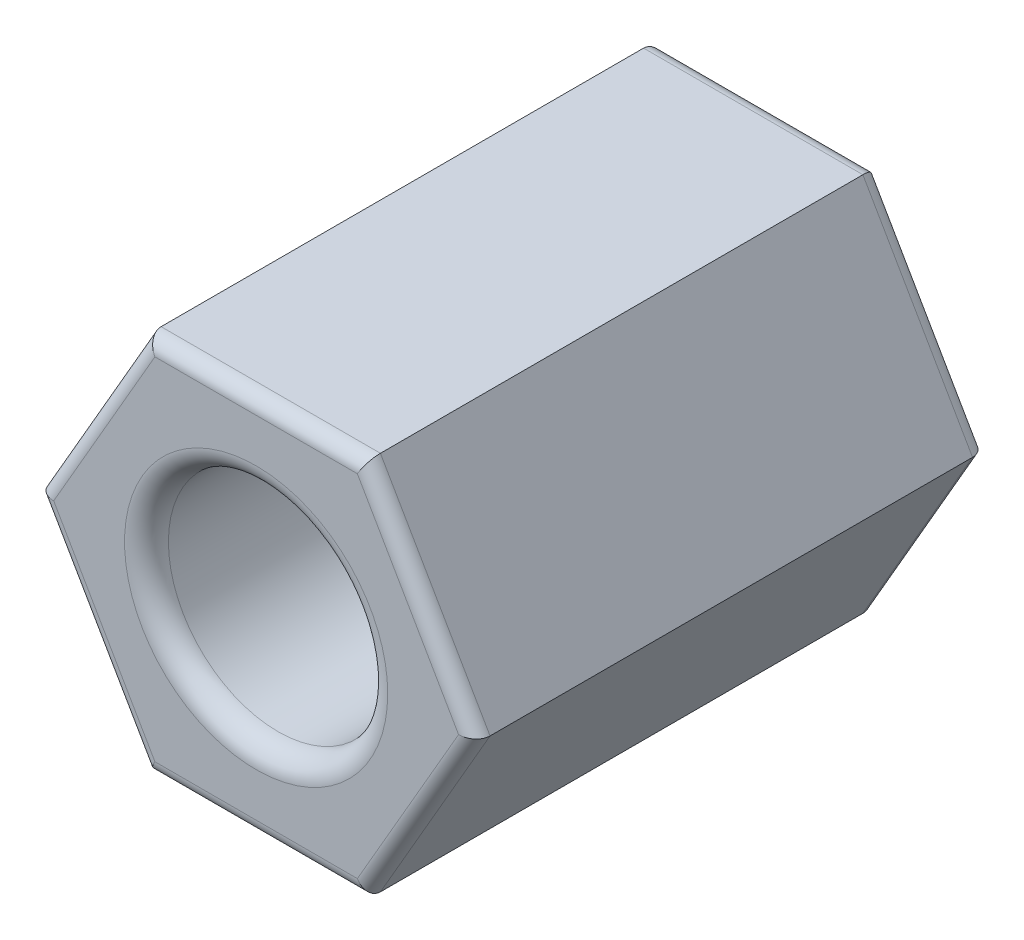
ISO-10303-21;
HEADER;
FILE_DESCRIPTION(('STEP AP214'),'2;1');
FILE_NAME('part.step','',(''),(''),'','','');
FILE_SCHEMA(('AUTOMOTIVE_DESIGN { 1 0 10303 214 1 1 1 1 }'));
ENDSEC;
DATA;
#1=APPLICATION_CONTEXT('core data for automotive mechanical design processes');
#2=APPLICATION_PROTOCOL_DEFINITION('international standard','automotive_design',2000,#1);
#3=PRODUCT_CONTEXT('',#1,'mechanical');
#4=PRODUCT('Part','Part','',(#3));
#5=PRODUCT_RELATED_PRODUCT_CATEGORY('part','',(#4));
#6=PRODUCT_DEFINITION_FORMATION('','',#4);
#7=PRODUCT_DEFINITION_CONTEXT('part definition',#1,'design');
#8=PRODUCT_DEFINITION('design','',#6,#7);
#9=PRODUCT_DEFINITION_SHAPE('','',#8);
#10=(LENGTH_UNIT() NAMED_UNIT(*) SI_UNIT(.MILLI.,.METRE.));
#11=(NAMED_UNIT(*) PLANE_ANGLE_UNIT() SI_UNIT($,.RADIAN.));
#12=(NAMED_UNIT(*) SI_UNIT($,.STERADIAN.) SOLID_ANGLE_UNIT());
#13=UNCERTAINTY_MEASURE_WITH_UNIT(LENGTH_MEASURE(1.E-05),#10,'distance_accuracy_value','');
#14=(GEOMETRIC_REPRESENTATION_CONTEXT(3) GLOBAL_UNCERTAINTY_ASSIGNED_CONTEXT((#13)) GLOBAL_UNIT_ASSIGNED_CONTEXT((#10,
#11,#12)) REPRESENTATION_CONTEXT('',''));
#15=CARTESIAN_POINT('',(0.,0.,0.));
#16=DIRECTION('',(0.,0.,1.));
#17=DIRECTION('',(1.,0.,0.));
#18=AXIS2_PLACEMENT_3D('',#15,#16,#17);
#19=CARTESIAN_POINT('',(0.,0.,7.));
#20=DIRECTION('',(0.,0.,1.));
#21=DIRECTION('',(1.,0.,0.));
#22=AXIS2_PLACEMENT_3D('',#19,#20,#21);
#23=PLANE('',#22);
#24=DIRECTION('',(-1.,0.,0.));
#25=VECTOR('',#24,1.);
#26=CARTESIAN_POINT('',(-1.50000000000001,2.39807621135331,7.));
#27=LINE('',#26,#25);
#28=CARTESIAN_POINT('',(1.38452994616207,2.39807621135332,7.));
#29=VERTEX_POINT('',#28);
#30=CARTESIAN_POINT('',(-1.38452994616209,2.39807621135331,7.));
#31=VERTEX_POINT('',#30);
#32=EDGE_CURVE('E130',#29,#31,#27,.T.);
#33=ORIENTED_EDGE('',*,*,#32,.T.);
#34=DIRECTION('',(-0.499999999999995,-0.866025403784442,0.));
#35=VECTOR('',#34,1.);
#36=CARTESIAN_POINT('',(-2.82679491924311,-0.10000000000002,7.));
#37=LINE('',#36,#35);
#38=CARTESIAN_POINT('',(-2.76905989232415,0.,7.));
#39=VERTEX_POINT('',#38);
#40=EDGE_CURVE('E163',#31,#39,#37,.T.);
#41=ORIENTED_EDGE('',*,*,#40,.T.);
#42=DIRECTION('',(0.500000000000007,-0.866025403784435,0.));
#43=VECTOR('',#42,1.);
#44=CARTESIAN_POINT('',(-1.32679491924309,-2.49807621135333,7.));
#45=LINE('',#44,#43);
#46=CARTESIAN_POINT('',(-1.38452994616205,-2.39807621135333,7.));
#47=VERTEX_POINT('',#46);
#48=EDGE_CURVE('E161',#39,#47,#45,.T.);
#49=ORIENTED_EDGE('',*,*,#48,.T.);
#50=DIRECTION('',(1.,0.,0.));
#51=VECTOR('',#50,1.);
#52=CARTESIAN_POINT('',(1.50000000000003,-2.3980762113533,7.));
#53=LINE('',#52,#51);
#54=CARTESIAN_POINT('',(1.3845299461621,-2.3980762113533,7.));
#55=VERTEX_POINT('',#54);
#56=EDGE_CURVE('E159',#47,#55,#53,.T.);
#57=ORIENTED_EDGE('',*,*,#56,.T.);
#58=DIRECTION('',(0.499999999999995,0.866025403784442,0.));
#59=VECTOR('',#58,1.);
#60=CARTESIAN_POINT('',(2.82679491924311,0.099999999999999,7.));
#61=LINE('',#60,#59);
#62=CARTESIAN_POINT('',(2.76905989232415,0.,7.));
#63=VERTEX_POINT('',#62);
#64=EDGE_CURVE('E133',#55,#63,#61,.T.);
#65=ORIENTED_EDGE('',*,*,#64,.T.);
#66=DIRECTION('',(-0.500000000000001,0.866025403784438,0.));
#67=VECTOR('',#66,1.);
#68=CARTESIAN_POINT('',(1.32679491924311,2.49807621135332,7.));
#69=LINE('',#68,#67);
#70=EDGE_CURVE('E125',#63,#29,#69,.T.);
#71=ORIENTED_EDGE('',*,*,#70,.T.);
#72=EDGE_LOOP('',(#33,#41,#49,#57,#65,#71));
#73=FACE_BOUND('',#72,.T.);
#74=CARTESIAN_POINT('',(0.,0.,7.));
#75=DIRECTION('',(0.,0.,1.));
#76=DIRECTION('',(1.,0.,0.));
#77=AXIS2_PLACEMENT_3D('',#74,#75,#76);
#78=CIRCLE('',#77,1.8);
#79=CARTESIAN_POINT('',(1.8,0.,7.));
#80=VERTEX_POINT('',#79);
#81=EDGE_CURVE('E151',#80,#80,#78,.F.);
#82=ORIENTED_EDGE('',*,*,#81,.T.);
#83=EDGE_LOOP('',(#82));
#84=FACE_BOUND('',#83,.T.);
#85=ADVANCED_FACE('F35',(#73,#84),#23,.T.);
#86=CARTESIAN_POINT('',(0.,0.,0.));
#87=DIRECTION('',(0.,0.,1.));
#88=DIRECTION('',(1.,0.,0.));
#89=AXIS2_PLACEMENT_3D('',#86,#87,#88);
#90=PLANE('',#89);
#91=DIRECTION('',(-0.500000000000001,0.866025403784438,0.));
#92=VECTOR('',#91,1.);
#93=CARTESIAN_POINT('',(2.07679491924311,1.19903810567666,0.));
#94=LINE('',#93,#92);
#95=CARTESIAN_POINT('',(1.38452994616207,2.39807621135332,0.));
#96=VERTEX_POINT('',#95);
#97=CARTESIAN_POINT('',(2.76905989232415,0.,0.));
#98=VERTEX_POINT('',#97);
#99=EDGE_CURVE('E190',#96,#98,#94,.F.);
#100=ORIENTED_EDGE('',*,*,#99,.T.);
#101=DIRECTION('',(0.499999999999995,0.866025403784442,0.));
#102=VECTOR('',#101,1.);
#103=CARTESIAN_POINT('',(2.07679491924313,-1.19903810567665,0.));
#104=LINE('',#103,#102);
#105=CARTESIAN_POINT('',(1.3845299461621,-2.3980762113533,0.));
#106=VERTEX_POINT('',#105);
#107=EDGE_CURVE('E11',#98,#106,#104,.F.);
#108=ORIENTED_EDGE('',*,*,#107,.T.);
#109=DIRECTION('',(1.,0.,0.));
#110=VECTOR('',#109,1.);
#111=CARTESIAN_POINT('',(0.,-2.39807621135331,0.));
#112=LINE('',#111,#110);
#113=CARTESIAN_POINT('',(-1.38452994616205,-2.39807621135333,0.));
#114=VERTEX_POINT('',#113);
#115=EDGE_CURVE('E44',#106,#114,#112,.F.);
#116=ORIENTED_EDGE('',*,*,#115,.T.);
#117=DIRECTION('',(0.500000000000007,-0.866025403784435,0.));
#118=VECTOR('',#117,1.);
#119=CARTESIAN_POINT('',(-2.0767949192431,-1.19903810567667,0.));
#120=LINE('',#119,#118);
#121=CARTESIAN_POINT('',(-2.76905989232415,0.,0.));
#122=VERTEX_POINT('',#121);
#123=EDGE_CURVE('E196',#114,#122,#120,.F.);
#124=ORIENTED_EDGE('',*,*,#123,.T.);
#125=DIRECTION('',(-0.499999999999995,-0.866025403784442,0.));
#126=VECTOR('',#125,1.);
#127=CARTESIAN_POINT('',(-2.07679491924312,1.19903810567665,0.));
#128=LINE('',#127,#126);
#129=CARTESIAN_POINT('',(-1.38452994616209,2.39807621135331,0.));
#130=VERTEX_POINT('',#129);
#131=EDGE_CURVE('E194',#122,#130,#128,.F.);
#132=ORIENTED_EDGE('',*,*,#131,.T.);
#133=DIRECTION('',(-1.,0.,0.));
#134=VECTOR('',#133,1.);
#135=CARTESIAN_POINT('',(0.,2.39807621135331,0.));
#136=LINE('',#135,#134);
#137=EDGE_CURVE('E192',#130,#96,#136,.F.);
#138=ORIENTED_EDGE('',*,*,#137,.T.);
#139=EDGE_LOOP('',(#100,#108,#116,#124,#132,#138));
#140=FACE_BOUND('',#139,.T.);
#141=CARTESIAN_POINT('',(0.,0.,0.));
#142=DIRECTION('',(0.,0.,1.));
#143=DIRECTION('',(1.,0.,0.));
#144=AXIS2_PLACEMENT_3D('',#141,#142,#143);
#145=CIRCLE('',#144,1.8);
#146=CARTESIAN_POINT('',(1.8,0.,0.));
#147=VERTEX_POINT('',#146);
#148=EDGE_CURVE('E254',#147,#147,#145,.T.);
#149=ORIENTED_EDGE('',*,*,#148,.T.);
#150=EDGE_LOOP('',(#149));
#151=FACE_BOUND('',#150,.T.);
#152=ADVANCED_FACE('F232',(#140,#151),#90,.F.);
#153=CARTESIAN_POINT('',(1.50000000000003,-2.5980762113533,7.));
#154=DIRECTION('',(-0.866025403784442,0.499999999999995,0.));
#155=DIRECTION('',(-0.499999999999995,-0.866025403784442,0.));
#156=AXIS2_PLACEMENT_3D('',#153,#154,#155);
#157=PLANE('',#156);
#158=DIRECTION('',(0.,0.,-1.));
#159=VECTOR('',#158,1.);
#160=CARTESIAN_POINT('',(3.,0.,7.));
#161=LINE('',#160,#159);
#162=CARTESIAN_POINT('',(3.,0.,6.8));
#163=VERTEX_POINT('',#162);
#164=CARTESIAN_POINT('',(3.,0.,0.2));
#165=VERTEX_POINT('',#164);
#166=EDGE_CURVE('E247',#163,#165,#161,.T.);
#167=ORIENTED_EDGE('',*,*,#166,.F.);
#168=DIRECTION('',(0.499999999999995,0.866025403784442,0.));
#169=VECTOR('',#168,1.);
#170=CARTESIAN_POINT('',(1.50000000000003,-2.5980762113533,6.8));
#171=LINE('',#170,#169);
#172=CARTESIAN_POINT('',(1.50000000000003,-2.5980762113533,6.8));
#173=VERTEX_POINT('',#172);
#174=EDGE_CURVE('E181',#163,#173,#171,.F.);
#175=ORIENTED_EDGE('',*,*,#174,.T.);
#176=DIRECTION('',(0.,0.,-1.));
#177=VECTOR('',#176,1.);
#178=CARTESIAN_POINT('',(1.50000000000003,-2.5980762113533,7.));
#179=LINE('',#178,#177);
#180=CARTESIAN_POINT('',(1.50000000000003,-2.5980762113533,0.2));
#181=VERTEX_POINT('',#180);
#182=EDGE_CURVE('E208',#173,#181,#179,.T.);
#183=ORIENTED_EDGE('',*,*,#182,.T.);
#184=DIRECTION('',(0.499999999999995,0.866025403784442,0.));
#185=VECTOR('',#184,1.);
#186=CARTESIAN_POINT('',(1.50000000000003,-2.5980762113533,0.2));
#187=LINE('',#186,#185);
#188=EDGE_CURVE('E178',#181,#165,#187,.T.);
#189=ORIENTED_EDGE('',*,*,#188,.T.);
#190=EDGE_LOOP('',(#167,#175,#183,#189));
#191=FACE_BOUND('',#190,.T.);
#192=ADVANCED_FACE('F246',(#191),#157,.F.);
#193=CARTESIAN_POINT('',(3.,0.,7.));
#194=DIRECTION('',(-0.866025403784438,-0.500000000000001,0.));
#195=DIRECTION('',(0.500000000000001,-0.866025403784438,0.));
#196=AXIS2_PLACEMENT_3D('',#193,#194,#195);
#197=PLANE('',#196);
#198=DIRECTION('',(0.,0.,-1.));
#199=VECTOR('',#198,1.);
#200=CARTESIAN_POINT('',(1.49999999999999,2.59807621135332,7.));
#201=LINE('',#200,#199);
#202=CARTESIAN_POINT('',(1.49999999999999,2.59807621135332,6.8));
#203=VERTEX_POINT('',#202);
#204=CARTESIAN_POINT('',(1.49999999999999,2.59807621135332,0.2));
#205=VERTEX_POINT('',#204);
#206=EDGE_CURVE('E255',#203,#205,#201,.T.);
#207=ORIENTED_EDGE('',*,*,#206,.F.);
#208=DIRECTION('',(-0.500000000000001,0.866025403784438,0.));
#209=VECTOR('',#208,1.);
#210=CARTESIAN_POINT('',(3.,0.,6.8));
#211=LINE('',#210,#209);
#212=EDGE_CURVE('E142',#203,#163,#211,.F.);
#213=ORIENTED_EDGE('',*,*,#212,.T.);
#214=ORIENTED_EDGE('',*,*,#166,.T.);
#215=DIRECTION('',(-0.500000000000001,0.866025403784438,0.));
#216=VECTOR('',#215,1.);
#217=CARTESIAN_POINT('',(3.,0.,0.2));
#218=LINE('',#217,#216);
#219=EDGE_CURVE('E183',#165,#205,#218,.T.);
#220=ORIENTED_EDGE('',*,*,#219,.T.);
#221=EDGE_LOOP('',(#207,#213,#214,#220));
#222=FACE_BOUND('',#221,.T.);
#223=ADVANCED_FACE('F252',(#222),#197,.F.);
#224=CARTESIAN_POINT('',(1.49999999999999,2.59807621135332,7.));
#225=DIRECTION('',(0.,-1.,0.));
#226=DIRECTION('',(1.,0.,0.));
#227=AXIS2_PLACEMENT_3D('',#224,#225,#226);
#228=PLANE('',#227);
#229=DIRECTION('',(0.,0.,-1.));
#230=VECTOR('',#229,1.);
#231=CARTESIAN_POINT('',(-1.50000000000001,2.59807621135331,7.));
#232=LINE('',#231,#230);
#233=CARTESIAN_POINT('',(-1.50000000000001,2.59807621135331,6.8));
#234=VERTEX_POINT('',#233);
#235=CARTESIAN_POINT('',(-1.50000000000001,2.59807621135331,0.2));
#236=VERTEX_POINT('',#235);
#237=EDGE_CURVE('E260',#234,#236,#232,.T.);
#238=ORIENTED_EDGE('',*,*,#237,.F.);
#239=DIRECTION('',(-1.,0.,0.));
#240=VECTOR('',#239,1.);
#241=CARTESIAN_POINT('',(1.49999999999999,2.59807621135332,6.8));
#242=LINE('',#241,#240);
#243=EDGE_CURVE('E188',#234,#203,#242,.F.);
#244=ORIENTED_EDGE('',*,*,#243,.T.);
#245=ORIENTED_EDGE('',*,*,#206,.T.);
#246=DIRECTION('',(-1.,0.,0.));
#247=VECTOR('',#246,1.);
#248=CARTESIAN_POINT('',(1.49999999999999,2.59807621135332,0.2));
#249=LINE('',#248,#247);
#250=EDGE_CURVE('E186',#205,#236,#249,.T.);
#251=ORIENTED_EDGE('',*,*,#250,.T.);
#252=EDGE_LOOP('',(#238,#244,#245,#251));
#253=FACE_BOUND('',#252,.T.);
#254=ADVANCED_FACE('F298',(#253),#228,.F.);
#255=CARTESIAN_POINT('',(-1.50000000000001,2.59807621135331,7.));
#256=DIRECTION('',(0.866025403784441,-0.499999999999995,0.));
#257=DIRECTION('',(0.499999999999995,0.866025403784442,0.));
#258=AXIS2_PLACEMENT_3D('',#255,#256,#257);
#259=PLANE('',#258);
#260=DIRECTION('',(0.,0.,-1.));
#261=VECTOR('',#260,1.);
#262=CARTESIAN_POINT('',(-3.,0.,7.));
#263=LINE('',#262,#261);
#264=CARTESIAN_POINT('',(-3.,0.,6.8));
#265=VERTEX_POINT('',#264);
#266=CARTESIAN_POINT('',(-3.,0.,0.2));
#267=VERTEX_POINT('',#266);
#268=EDGE_CURVE('E483',#265,#267,#263,.T.);
#269=ORIENTED_EDGE('',*,*,#268,.F.);
#270=DIRECTION('',(-0.499999999999995,-0.866025403784442,0.));
#271=VECTOR('',#270,1.);
#272=CARTESIAN_POINT('',(-1.50000000000001,2.59807621135331,6.8));
#273=LINE('',#272,#271);
#274=EDGE_CURVE('E167',#265,#234,#273,.F.);
#275=ORIENTED_EDGE('',*,*,#274,.T.);
#276=ORIENTED_EDGE('',*,*,#237,.T.);
#277=DIRECTION('',(-0.499999999999995,-0.866025403784442,0.));
#278=VECTOR('',#277,1.);
#279=CARTESIAN_POINT('',(-1.50000000000001,2.59807621135331,0.2));
#280=LINE('',#279,#278);
#281=EDGE_CURVE('E165',#236,#267,#280,.T.);
#282=ORIENTED_EDGE('',*,*,#281,.T.);
#283=EDGE_LOOP('',(#269,#275,#276,#282));
#284=FACE_BOUND('',#283,.T.);
#285=ADVANCED_FACE('F294',(#284),#259,.F.);
#286=CARTESIAN_POINT('',(-3.,0.,7.));
#287=DIRECTION('',(0.866025403784434,0.500000000000007,0.));
#288=DIRECTION('',(-0.500000000000007,0.866025403784435,0.));
#289=AXIS2_PLACEMENT_3D('',#286,#287,#288);
#290=PLANE('',#289);
#291=DIRECTION('',(0.,0.,-1.));
#292=VECTOR('',#291,1.);
#293=CARTESIAN_POINT('',(-1.49999999999998,-2.59807621135333,7.));
#294=LINE('',#293,#292);
#295=CARTESIAN_POINT('',(-1.49999999999998,-2.59807621135333,6.8));
#296=VERTEX_POINT('',#295);
#297=CARTESIAN_POINT('',(-1.49999999999998,-2.59807621135333,0.2));
#298=VERTEX_POINT('',#297);
#299=EDGE_CURVE('E480',#296,#298,#294,.T.);
#300=ORIENTED_EDGE('',*,*,#299,.F.);
#301=DIRECTION('',(0.500000000000007,-0.866025403784435,0.));
#302=VECTOR('',#301,1.);
#303=CARTESIAN_POINT('',(-3.,0.,6.8));
#304=LINE('',#303,#302);
#305=EDGE_CURVE('E172',#296,#265,#304,.F.);
#306=ORIENTED_EDGE('',*,*,#305,.T.);
#307=ORIENTED_EDGE('',*,*,#268,.T.);
#308=DIRECTION('',(0.500000000000007,-0.866025403784435,0.));
#309=VECTOR('',#308,1.);
#310=CARTESIAN_POINT('',(-3.,0.,0.2));
#311=LINE('',#310,#309);
#312=EDGE_CURVE('E170',#267,#298,#311,.T.);
#313=ORIENTED_EDGE('',*,*,#312,.T.);
#314=EDGE_LOOP('',(#300,#306,#307,#313));
#315=FACE_BOUND('',#314,.T.);
#316=ADVANCED_FACE('F290',(#315),#290,.F.);
#317=CARTESIAN_POINT('',(-1.49999999999998,-2.59807621135333,7.));
#318=DIRECTION('',(0.,1.,0.));
#319=DIRECTION('',(-1.,0.,0.));
#320=AXIS2_PLACEMENT_3D('',#317,#318,#319);
#321=PLANE('',#320);
#322=ORIENTED_EDGE('',*,*,#182,.F.);
#323=DIRECTION('',(1.,0.,0.));
#324=VECTOR('',#323,1.);
#325=CARTESIAN_POINT('',(-1.49999999999998,-2.59807621135333,6.8));
#326=LINE('',#325,#324);
#327=EDGE_CURVE('E176',#173,#296,#326,.F.);
#328=ORIENTED_EDGE('',*,*,#327,.T.);
#329=ORIENTED_EDGE('',*,*,#299,.T.);
#330=DIRECTION('',(1.,0.,0.));
#331=VECTOR('',#330,1.);
#332=CARTESIAN_POINT('',(-1.49999999999998,-2.59807621135333,0.2));
#333=LINE('',#332,#331);
#334=EDGE_CURVE('E174',#298,#181,#333,.T.);
#335=ORIENTED_EDGE('',*,*,#334,.T.);
#336=EDGE_LOOP('',(#322,#328,#329,#335));
#337=FACE_BOUND('',#336,.T.);
#338=ADVANCED_FACE('F287',(#337),#321,.F.);
#339=CARTESIAN_POINT('',(0.,0.,7.));
#340=DIRECTION('',(0.,0.,-1.));
#341=DIRECTION('',(-1.,0.,0.));
#342=AXIS2_PLACEMENT_3D('',#339,#340,#341);
#343=CYLINDRICAL_SURFACE('',#342,1.5);
#344=CARTESIAN_POINT('',(0.,0.,0.3));
#345=DIRECTION('',(0.,0.,1.));
#346=DIRECTION('',(1.,0.,0.));
#347=AXIS2_PLACEMENT_3D('',#344,#345,#346);
#348=CIRCLE('',#347,1.5);
#349=CARTESIAN_POINT('',(1.5,0.,0.3));
#350=VERTEX_POINT('',#349);
#351=EDGE_CURVE('E154',#350,#350,#348,.F.);
#352=ORIENTED_EDGE('',*,*,#351,.T.);
#353=EDGE_LOOP('',(#352));
#354=FACE_BOUND('',#353,.T.);
#355=CARTESIAN_POINT('',(0.,0.,6.7));
#356=DIRECTION('',(0.,0.,1.));
#357=DIRECTION('',(1.,0.,0.));
#358=AXIS2_PLACEMENT_3D('',#355,#356,#357);
#359=CIRCLE('',#358,1.5);
#360=CARTESIAN_POINT('',(1.5,0.,6.7));
#361=VERTEX_POINT('',#360);
#362=EDGE_CURVE('E258',#361,#361,#359,.T.);
#363=ORIENTED_EDGE('',*,*,#362,.T.);
#364=EDGE_LOOP('',(#363));
#365=FACE_BOUND('',#364,.T.);
#366=ADVANCED_FACE('F268',(#354,#365),#343,.F.);
#367=CARTESIAN_POINT('',(0.,0.,0.3));
#368=DIRECTION('',(0.,0.,1.));
#369=DIRECTION('',(1.,0.,0.));
#370=AXIS2_PLACEMENT_3D('',#367,#368,#369);
#371=TOROIDAL_SURFACE('',#370,1.8,0.3);
#372=ORIENTED_EDGE('',*,*,#351,.F.);
#373=EDGE_LOOP('',(#372));
#374=FACE_BOUND('',#373,.T.);
#375=ORIENTED_EDGE('',*,*,#148,.F.);
#376=EDGE_LOOP('',(#375));
#377=FACE_BOUND('',#376,.T.);
#378=ADVANCED_FACE('F271',(#374,#377),#371,.T.);
#379=CARTESIAN_POINT('',(0.,0.,6.7));
#380=DIRECTION('',(0.,0.,1.));
#381=DIRECTION('',(1.,0.,0.));
#382=AXIS2_PLACEMENT_3D('',#379,#380,#381);
#383=TOROIDAL_SURFACE('',#382,1.8,0.3);
#384=ORIENTED_EDGE('',*,*,#81,.F.);
#385=EDGE_LOOP('',(#384));
#386=FACE_BOUND('',#385,.T.);
#387=ORIENTED_EDGE('',*,*,#362,.F.);
#388=EDGE_LOOP('',(#387));
#389=FACE_BOUND('',#388,.T.);
#390=ADVANCED_FACE('F274',(#386,#389),#383,.T.);
#391=CARTESIAN_POINT('',(2.07679491924313,-1.19903810567665,6.8));
#392=DIRECTION('',(-0.499999999999995,-0.866025403784442,0.));
#393=DIRECTION('',(0.866025403784442,-0.499999999999995,0.));
#394=AXIS2_PLACEMENT_3D('',#391,#392,#393);
#395=CYLINDRICAL_SURFACE('',#394,0.2);
#396=CARTESIAN_POINT('',(1.3845299461621,-2.3980762113533,6.8));
#397=DIRECTION('',(-0.866025403784434,-0.500000000000007,0.));
#398=DIRECTION('',(0.500000000000007,-0.866025403784435,0.));
#399=AXIS2_PLACEMENT_3D('',#396,#397,#398);
#400=ELLIPSE('',#399,0.23094010767585,0.2);
#401=EDGE_CURVE('E145',#173,#55,#400,.T.);
#402=ORIENTED_EDGE('',*,*,#401,.F.);
#403=ORIENTED_EDGE('',*,*,#174,.F.);
#404=CARTESIAN_POINT('',(2.76905989232415,0.,6.8));
#405=DIRECTION('',(0.,-1.,0.));
#406=DIRECTION('',(1.,0.,0.));
#407=AXIS2_PLACEMENT_3D('',#404,#405,#406);
#408=ELLIPSE('',#407,0.23094010767585,0.2);
#409=EDGE_CURVE('E206',#63,#163,#408,.F.);
#410=ORIENTED_EDGE('',*,*,#409,.F.);
#411=ORIENTED_EDGE('',*,*,#64,.F.);
#412=EDGE_LOOP('',(#402,#403,#410,#411));
#413=FACE_BOUND('',#412,.T.);
#414=ADVANCED_FACE('F307',(#413),#395,.T.);
#415=CARTESIAN_POINT('',(2.07679491924311,1.19903810567666,6.8));
#416=DIRECTION('',(0.500000000000001,-0.866025403784438,0.));
#417=DIRECTION('',(0.866025403784438,0.500000000000001,0.));
#418=AXIS2_PLACEMENT_3D('',#415,#416,#417);
#419=CYLINDRICAL_SURFACE('',#418,0.2);
#420=ORIENTED_EDGE('',*,*,#409,.T.);
#421=ORIENTED_EDGE('',*,*,#212,.F.);
#422=CARTESIAN_POINT('',(1.38452994616207,2.39807621135332,6.8));
#423=DIRECTION('',(0.86602540378444,-0.499999999999998,0.));
#424=DIRECTION('',(0.499999999999998,0.86602540378444,0.));
#425=AXIS2_PLACEMENT_3D('',#422,#423,#424);
#426=ELLIPSE('',#425,0.23094010767585,0.2);
#427=EDGE_CURVE('E140',#29,#203,#426,.F.);
#428=ORIENTED_EDGE('',*,*,#427,.F.);
#429=ORIENTED_EDGE('',*,*,#70,.F.);
#430=EDGE_LOOP('',(#420,#421,#428,#429));
#431=FACE_BOUND('',#430,.T.);
#432=ADVANCED_FACE('F141',(#431),#419,.T.);
#433=CARTESIAN_POINT('',(0.,-2.39807621135331,6.8));
#434=DIRECTION('',(-1.,0.,0.));
#435=DIRECTION('',(0.,-1.,0.));
#436=AXIS2_PLACEMENT_3D('',#433,#434,#435);
#437=CYLINDRICAL_SURFACE('',#436,0.2);
#438=ORIENTED_EDGE('',*,*,#401,.T.);
#439=ORIENTED_EDGE('',*,*,#56,.F.);
#440=CARTESIAN_POINT('',(-1.38452994616205,-2.39807621135333,6.8));
#441=DIRECTION('',(-0.866025403784443,0.499999999999992,0.));
#442=DIRECTION('',(-0.499999999999992,-0.866025403784443,0.));
#443=AXIS2_PLACEMENT_3D('',#440,#441,#442);
#444=ELLIPSE('',#443,0.23094010767585,0.2);
#445=EDGE_CURVE('E146',#296,#47,#444,.T.);
#446=ORIENTED_EDGE('',*,*,#445,.F.);
#447=ORIENTED_EDGE('',*,*,#327,.F.);
#448=EDGE_LOOP('',(#438,#439,#446,#447));
#449=FACE_BOUND('',#448,.T.);
#450=ADVANCED_FACE('F319',(#449),#437,.T.);
#451=CARTESIAN_POINT('',(0.,2.39807621135331,6.8));
#452=DIRECTION('',(1.,0.,0.));
#453=DIRECTION('',(0.,1.,0.));
#454=AXIS2_PLACEMENT_3D('',#451,#452,#453);
#455=CYLINDRICAL_SURFACE('',#454,0.2);
#456=ORIENTED_EDGE('',*,*,#427,.T.);
#457=ORIENTED_EDGE('',*,*,#243,.F.);
#458=CARTESIAN_POINT('',(-1.38452994616209,2.39807621135331,6.8));
#459=DIRECTION('',(0.866025403784436,0.500000000000004,0.));
#460=DIRECTION('',(0.500000000000004,-0.866025403784436,0.));
#461=AXIS2_PLACEMENT_3D('',#458,#459,#460);
#462=ELLIPSE('',#461,0.23094010767585,0.2);
#463=EDGE_CURVE('E149',#31,#234,#462,.F.);
#464=ORIENTED_EDGE('',*,*,#463,.F.);
#465=ORIENTED_EDGE('',*,*,#32,.F.);
#466=EDGE_LOOP('',(#456,#457,#464,#465));
#467=FACE_BOUND('',#466,.T.);
#468=ADVANCED_FACE('F148',(#467),#455,.T.);
#469=CARTESIAN_POINT('',(-2.0767949192431,-1.19903810567667,6.8));
#470=DIRECTION('',(-0.500000000000007,0.866025403784435,0.));
#471=DIRECTION('',(-0.866025403784434,-0.500000000000007,0.));
#472=AXIS2_PLACEMENT_3D('',#469,#470,#471);
#473=CYLINDRICAL_SURFACE('',#472,0.2);
#474=ORIENTED_EDGE('',*,*,#445,.T.);
#475=ORIENTED_EDGE('',*,*,#48,.F.);
#476=CARTESIAN_POINT('',(-2.76905989232415,0.,6.8));
#477=DIRECTION('',(0.,1.,0.));
#478=DIRECTION('',(-1.,0.,0.));
#479=AXIS2_PLACEMENT_3D('',#476,#477,#478);
#480=ELLIPSE('',#479,0.23094010767585,0.2);
#481=EDGE_CURVE('E199',#265,#39,#480,.T.);
#482=ORIENTED_EDGE('',*,*,#481,.F.);
#483=ORIENTED_EDGE('',*,*,#305,.F.);
#484=EDGE_LOOP('',(#474,#475,#482,#483));
#485=FACE_BOUND('',#484,.T.);
#486=ADVANCED_FACE('F312',(#485),#473,.T.);
#487=CARTESIAN_POINT('',(-2.07679491924312,1.19903810567665,6.8));
#488=DIRECTION('',(0.499999999999995,0.866025403784442,0.));
#489=DIRECTION('',(-0.866025403784441,0.499999999999995,0.));
#490=AXIS2_PLACEMENT_3D('',#487,#488,#489);
#491=CYLINDRICAL_SURFACE('',#490,0.2);
#492=ORIENTED_EDGE('',*,*,#463,.T.);
#493=ORIENTED_EDGE('',*,*,#274,.F.);
#494=ORIENTED_EDGE('',*,*,#481,.T.);
#495=ORIENTED_EDGE('',*,*,#40,.F.);
#496=EDGE_LOOP('',(#492,#493,#494,#495));
#497=FACE_BOUND('',#496,.T.);
#498=ADVANCED_FACE('F309',(#497),#491,.T.);
#499=CARTESIAN_POINT('',(-1.32679491924312,2.49807621135331,0.2));
#500=DIRECTION('',(-0.499999999999995,-0.866025403784442,0.));
#501=DIRECTION('',(0.866025403784441,-0.499999999999995,0.));
#502=AXIS2_PLACEMENT_3D('',#499,#500,#501);
#503=CYLINDRICAL_SURFACE('',#502,0.2);
#504=CARTESIAN_POINT('',(-1.38452994616209,2.39807621135331,0.2));
#505=DIRECTION('',(-0.866025403784436,-0.500000000000004,0.));
#506=DIRECTION('',(-0.500000000000004,0.866025403784436,0.));
#507=AXIS2_PLACEMENT_3D('',#504,#505,#506);
#508=ELLIPSE('',#507,0.23094010767585,0.2);
#509=EDGE_CURVE('E217',#130,#236,#508,.F.);
#510=ORIENTED_EDGE('',*,*,#509,.F.);
#511=ORIENTED_EDGE('',*,*,#131,.F.);
#512=CARTESIAN_POINT('',(-2.76905989232415,0.,0.2));
#513=DIRECTION('',(0.,-1.,0.));
#514=DIRECTION('',(-1.,0.,0.));
#515=AXIS2_PLACEMENT_3D('',#512,#513,#514);
#516=ELLIPSE('',#515,0.23094010767585,0.2);
#517=EDGE_CURVE('E39',#267,#122,#516,.T.);
#518=ORIENTED_EDGE('',*,*,#517,.F.);
#519=ORIENTED_EDGE('',*,*,#281,.F.);
#520=EDGE_LOOP('',(#510,#511,#518,#519));
#521=FACE_BOUND('',#520,.T.);
#522=ADVANCED_FACE('F37',(#521),#503,.T.);
#523=CARTESIAN_POINT('',(-2.82679491924311,0.0999999999999805,0.2));
#524=DIRECTION('',(0.500000000000007,-0.866025403784435,0.));
#525=DIRECTION('',(0.866025403784434,0.500000000000007,0.));
#526=AXIS2_PLACEMENT_3D('',#523,#524,#525);
#527=CYLINDRICAL_SURFACE('',#526,0.2);
#528=ORIENTED_EDGE('',*,*,#517,.T.);
#529=ORIENTED_EDGE('',*,*,#123,.F.);
#530=CARTESIAN_POINT('',(-1.38452994616205,-2.39807621135333,0.2));
#531=DIRECTION('',(0.866025403784443,-0.499999999999992,0.));
#532=DIRECTION('',(-0.499999999999992,-0.866025403784443,0.));
#533=AXIS2_PLACEMENT_3D('',#530,#531,#532);
#534=ELLIPSE('',#533,0.23094010767585,0.2);
#535=EDGE_CURVE('E215',#298,#114,#534,.T.);
#536=ORIENTED_EDGE('',*,*,#535,.F.);
#537=ORIENTED_EDGE('',*,*,#312,.F.);
#538=EDGE_LOOP('',(#528,#529,#536,#537));
#539=FACE_BOUND('',#538,.T.);
#540=ADVANCED_FACE('F227',(#539),#527,.T.);
#541=CARTESIAN_POINT('',(1.49999999999999,2.39807621135332,0.2));
#542=DIRECTION('',(-1.,0.,0.));
#543=DIRECTION('',(0.,-1.,0.));
#544=AXIS2_PLACEMENT_3D('',#541,#542,#543);
#545=CYLINDRICAL_SURFACE('',#544,0.2);
#546=ORIENTED_EDGE('',*,*,#509,.T.);
#547=ORIENTED_EDGE('',*,*,#250,.F.);
#548=CARTESIAN_POINT('',(1.38452994616207,2.39807621135332,0.2));
#549=DIRECTION('',(-0.86602540378444,0.499999999999998,0.));
#550=DIRECTION('',(0.499999999999998,0.86602540378444,0.));
#551=AXIS2_PLACEMENT_3D('',#548,#549,#550);
#552=ELLIPSE('',#551,0.23094010767585,0.2);
#553=EDGE_CURVE('E212',#96,#205,#552,.F.);
#554=ORIENTED_EDGE('',*,*,#553,.F.);
#555=ORIENTED_EDGE('',*,*,#137,.F.);
#556=EDGE_LOOP('',(#546,#547,#554,#555));
#557=FACE_BOUND('',#556,.T.);
#558=ADVANCED_FACE('F236',(#557),#545,.T.);
#559=CARTESIAN_POINT('',(-1.49999999999998,-2.39807621135333,0.2));
#560=DIRECTION('',(1.,0.,0.));
#561=DIRECTION('',(0.,1.,0.));
#562=AXIS2_PLACEMENT_3D('',#559,#560,#561);
#563=CYLINDRICAL_SURFACE('',#562,0.2);
#564=ORIENTED_EDGE('',*,*,#535,.T.);
#565=ORIENTED_EDGE('',*,*,#115,.F.);
#566=CARTESIAN_POINT('',(1.3845299461621,-2.3980762113533,0.2));
#567=DIRECTION('',(0.866025403784434,0.500000000000007,0.));
#568=DIRECTION('',(0.500000000000007,-0.866025403784435,0.));
#569=AXIS2_PLACEMENT_3D('',#566,#567,#568);
#570=ELLIPSE('',#569,0.23094010767585,0.2);
#571=EDGE_CURVE('E52',#181,#106,#570,.T.);
#572=ORIENTED_EDGE('',*,*,#571,.F.);
#573=ORIENTED_EDGE('',*,*,#334,.F.);
#574=EDGE_LOOP('',(#564,#565,#572,#573));
#575=FACE_BOUND('',#574,.T.);
#576=ADVANCED_FACE('F332',(#575),#563,.T.);
#577=CARTESIAN_POINT('',(2.82679491924311,-0.1,0.2));
#578=DIRECTION('',(-0.500000000000001,0.866025403784438,0.));
#579=DIRECTION('',(-0.866025403784438,-0.500000000000001,0.));
#580=AXIS2_PLACEMENT_3D('',#577,#578,#579);
#581=CYLINDRICAL_SURFACE('',#580,0.2);
#582=ORIENTED_EDGE('',*,*,#553,.T.);
#583=ORIENTED_EDGE('',*,*,#219,.F.);
#584=CARTESIAN_POINT('',(2.76905989232415,0.,0.2));
#585=DIRECTION('',(0.,1.,0.));
#586=DIRECTION('',(-1.,0.,0.));
#587=AXIS2_PLACEMENT_3D('',#584,#585,#586);
#588=ELLIPSE('',#587,0.23094010767585,0.2);
#589=EDGE_CURVE('E209',#98,#165,#588,.F.);
#590=ORIENTED_EDGE('',*,*,#589,.F.);
#591=ORIENTED_EDGE('',*,*,#99,.F.);
#592=EDGE_LOOP('',(#582,#583,#590,#591));
#593=FACE_BOUND('',#592,.T.);
#594=ADVANCED_FACE('F240',(#593),#581,.T.);
#595=CARTESIAN_POINT('',(1.32679491924314,-2.4980762113533,0.2));
#596=DIRECTION('',(0.499999999999995,0.866025403784442,0.));
#597=DIRECTION('',(-0.866025403784442,0.499999999999995,0.));
#598=AXIS2_PLACEMENT_3D('',#595,#596,#597);
#599=CYLINDRICAL_SURFACE('',#598,0.2);
#600=ORIENTED_EDGE('',*,*,#571,.T.);
#601=ORIENTED_EDGE('',*,*,#107,.F.);
#602=ORIENTED_EDGE('',*,*,#589,.T.);
#603=ORIENTED_EDGE('',*,*,#188,.F.);
#604=EDGE_LOOP('',(#600,#601,#602,#603));
#605=FACE_BOUND('',#604,.T.);
#606=ADVANCED_FACE('F241',(#605),#599,.T.);
#607=CLOSED_SHELL('',(#85,#152,#192,#223,#254,#285,#316,#338,#366,#378,#390,#414,#432,#450,#468,
#486,#498,#522,#540,#558,#576,#594,#606));
#608=MANIFOLD_SOLID_BREP('B2',#607);
#609=ADVANCED_BREP_SHAPE_REPRESENTATION('',(#18,#608),#14);
#610=SHAPE_DEFINITION_REPRESENTATION(#9,#609);
ENDSEC;
END-ISO-10303-21;
